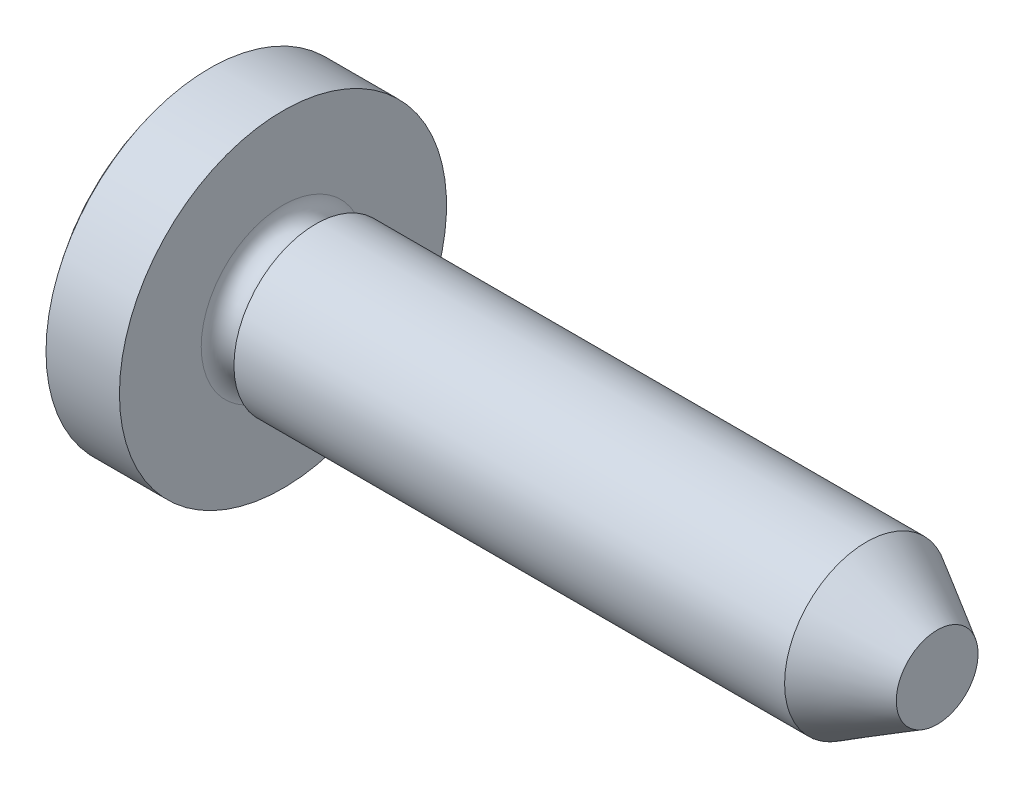
ISO-10303-21;
HEADER;
FILE_DESCRIPTION(('STEP AP214'),'2;1');
FILE_NAME('part.step','',(''),(''),'','','');
FILE_SCHEMA(('AUTOMOTIVE_DESIGN { 1 0 10303 214 1 1 1 1 }'));
ENDSEC;
DATA;
#1=APPLICATION_CONTEXT('core data for automotive mechanical design processes');
#2=APPLICATION_PROTOCOL_DEFINITION('international standard','automotive_design',2000,#1);
#3=PRODUCT_CONTEXT('',#1,'mechanical');
#4=PRODUCT('Part','Part','',(#3));
#5=PRODUCT_RELATED_PRODUCT_CATEGORY('part','',(#4));
#6=PRODUCT_DEFINITION_FORMATION('','',#4);
#7=PRODUCT_DEFINITION_CONTEXT('part definition',#1,'design');
#8=PRODUCT_DEFINITION('design','',#6,#7);
#9=PRODUCT_DEFINITION_SHAPE('','',#8);
#10=(LENGTH_UNIT() NAMED_UNIT(*) SI_UNIT(.MILLI.,.METRE.));
#11=(NAMED_UNIT(*) PLANE_ANGLE_UNIT() SI_UNIT($,.RADIAN.));
#12=(NAMED_UNIT(*) SI_UNIT($,.STERADIAN.) SOLID_ANGLE_UNIT());
#13=UNCERTAINTY_MEASURE_WITH_UNIT(LENGTH_MEASURE(1.E-05),#10,'distance_accuracy_value','');
#14=(GEOMETRIC_REPRESENTATION_CONTEXT(3) GLOBAL_UNCERTAINTY_ASSIGNED_CONTEXT((#13)) GLOBAL_UNIT_ASSIGNED_CONTEXT((#10,
#11,#12)) REPRESENTATION_CONTEXT('',''));
#15=CARTESIAN_POINT('',(0.,0.,0.));
#16=DIRECTION('',(0.,0.,1.));
#17=DIRECTION('',(1.,0.,0.));
#18=AXIS2_PLACEMENT_3D('',#15,#16,#17);
#19=CARTESIAN_POINT('',(0.9,0.189999999999999,-0.190000000000001));
#20=DIRECTION('',(-1.,0.,0.));
#21=DIRECTION('',(0.,0.,1.));
#22=AXIS2_PLACEMENT_3D('',#19,#20,#21);
#23=PLANE('',#22);
#24=DIRECTION('',(0.,1.,0.));
#25=VECTOR('',#24,1.);
#26=CARTESIAN_POINT('',(0.9,0.949999999999999,0.189999999999999));
#27=LINE('',#26,#25);
#28=CARTESIAN_POINT('',(0.9,0.430384757729334,0.189999999999999));
#29=VERTEX_POINT('',#28);
#30=CARTESIAN_POINT('',(0.9,0.189999999999999,0.189999999999999));
#31=VERTEX_POINT('',#30);
#32=EDGE_CURVE('E350',#29,#31,#27,.F.);
#33=ORIENTED_EDGE('',*,*,#32,.F.);
#34=DIRECTION('',(0.,0.,1.));
#35=VECTOR('',#34,1.);
#36=CARTESIAN_POINT('',(0.9,0.430384757729334,0.));
#37=LINE('',#36,#35);
#38=CARTESIAN_POINT('',(0.9,0.430384757729334,-0.190000000000001));
#39=VERTEX_POINT('',#38);
#40=EDGE_CURVE('E345',#39,#29,#37,.T.);
#41=ORIENTED_EDGE('',*,*,#40,.F.);
#42=DIRECTION('',(0.,-1.,0.));
#43=VECTOR('',#42,1.);
#44=CARTESIAN_POINT('',(0.9,0.949999999999999,-0.190000000000001));
#45=LINE('',#44,#43);
#46=CARTESIAN_POINT('',(0.9,0.189999999999999,-0.190000000000001));
#47=VERTEX_POINT('',#46);
#48=EDGE_CURVE('E340',#47,#39,#45,.F.);
#49=ORIENTED_EDGE('',*,*,#48,.F.);
#50=DIRECTION('',(0.,0.,-1.));
#51=VECTOR('',#50,1.);
#52=CARTESIAN_POINT('',(0.9,0.189999999999999,-0.190000000000001));
#53=LINE('',#52,#51);
#54=CARTESIAN_POINT('',(0.9,0.189999999999999,-0.430384757729337));
#55=VERTEX_POINT('',#54);
#56=EDGE_CURVE('E335',#55,#47,#53,.F.);
#57=ORIENTED_EDGE('',*,*,#56,.F.);
#58=DIRECTION('',(0.,1.,0.));
#59=VECTOR('',#58,1.);
#60=CARTESIAN_POINT('',(0.9,0.,-0.430384757729337));
#61=LINE('',#60,#59);
#62=CARTESIAN_POINT('',(0.9,-0.190000000000001,-0.430384757729337));
#63=VERTEX_POINT('',#62);
#64=EDGE_CURVE('E330',#63,#55,#61,.T.);
#65=ORIENTED_EDGE('',*,*,#64,.F.);
#66=DIRECTION('',(0.,0.,1.));
#67=VECTOR('',#66,1.);
#68=CARTESIAN_POINT('',(0.9,-0.190000000000001,-0.190000000000001));
#69=LINE('',#68,#67);
#70=CARTESIAN_POINT('',(0.9,-0.190000000000001,-0.190000000000001));
#71=VERTEX_POINT('',#70);
#72=EDGE_CURVE('E324',#71,#63,#69,.F.);
#73=ORIENTED_EDGE('',*,*,#72,.F.);
#74=DIRECTION('',(0.,1.,0.));
#75=VECTOR('',#74,1.);
#76=CARTESIAN_POINT('',(0.9,-0.95,-0.190000000000001));
#77=LINE('',#76,#75);
#78=CARTESIAN_POINT('',(0.9,-0.430384757729336,-0.190000000000001));
#79=VERTEX_POINT('',#78);
#80=EDGE_CURVE('E379',#79,#71,#77,.T.);
#81=ORIENTED_EDGE('',*,*,#80,.F.);
#82=DIRECTION('',(0.,0.,1.));
#83=VECTOR('',#82,1.);
#84=CARTESIAN_POINT('',(0.9,-0.430384757729336,0.));
#85=LINE('',#84,#83);
#86=CARTESIAN_POINT('',(0.9,-0.430384757729336,0.189999999999999));
#87=VERTEX_POINT('',#86);
#88=EDGE_CURVE('E375',#87,#79,#85,.F.);
#89=ORIENTED_EDGE('',*,*,#88,.F.);
#90=DIRECTION('',(0.,1.,0.));
#91=VECTOR('',#90,1.);
#92=CARTESIAN_POINT('',(0.9,-0.95,0.189999999999999));
#93=LINE('',#92,#91);
#94=CARTESIAN_POINT('',(0.9,-0.190000000000001,0.189999999999999));
#95=VERTEX_POINT('',#94);
#96=EDGE_CURVE('E370',#95,#87,#93,.F.);
#97=ORIENTED_EDGE('',*,*,#96,.F.);
#98=DIRECTION('',(0.,0.,1.));
#99=VECTOR('',#98,1.);
#100=CARTESIAN_POINT('',(0.9,-0.190000000000001,0.189999999999999));
#101=LINE('',#100,#99);
#102=CARTESIAN_POINT('',(0.9,-0.190000000000001,0.430384757729335));
#103=VERTEX_POINT('',#102);
#104=EDGE_CURVE('E365',#103,#95,#101,.F.);
#105=ORIENTED_EDGE('',*,*,#104,.F.);
#106=DIRECTION('',(0.,1.,0.));
#107=VECTOR('',#106,1.);
#108=CARTESIAN_POINT('',(0.9,0.,0.430384757729335));
#109=LINE('',#108,#107);
#110=CARTESIAN_POINT('',(0.9,0.189999999999999,0.430384757729335));
#111=VERTEX_POINT('',#110);
#112=EDGE_CURVE('E360',#111,#103,#109,.F.);
#113=ORIENTED_EDGE('',*,*,#112,.F.);
#114=DIRECTION('',(0.,0.,-1.));
#115=VECTOR('',#114,1.);
#116=CARTESIAN_POINT('',(0.9,0.189999999999999,0.189999999999999));
#117=LINE('',#116,#115);
#118=EDGE_CURVE('E355',#31,#111,#117,.F.);
#119=ORIENTED_EDGE('',*,*,#118,.F.);
#120=EDGE_LOOP('',(#33,#41,#49,#57,#65,#73,#81,#89,#97,#105,#113,#119));
#121=FACE_BOUND('',#120,.T.);
#122=ADVANCED_FACE('F17',(#121),#23,.T.);
#123=CARTESIAN_POINT('',(0.9,-0.95,-0.190000000000001));
#124=DIRECTION('',(0.,0.,1.));
#125=DIRECTION('',(1.,0.,0.));
#126=AXIS2_PLACEMENT_3D('',#123,#124,#125);
#127=PLANE('',#126);
#128=ORIENTED_EDGE('',*,*,#80,.T.);
#129=DIRECTION('',(1.,0.,0.));
#130=VECTOR('',#129,1.);
#131=CARTESIAN_POINT('',(0.9,-0.190000000000001,-0.190000000000001));
#132=LINE('',#131,#130);
#133=CARTESIAN_POINT('',(0.0113012058207812,-0.190000000000001,-0.190000000000001));
#134=VERTEX_POINT('',#133);
#135=EDGE_CURVE('E327',#134,#71,#132,.T.);
#136=ORIENTED_EDGE('',*,*,#135,.F.);
#137=CARTESIAN_POINT('',(0.128116518841079,-0.876031893359466,-0.190000000000001));
#138=CARTESIAN_POINT('',(0.0961555078613219,-0.763820306813493,-0.190000000000008));
#139=CARTESIAN_POINT('',(0.070440392953086,-0.650545189093898,-0.190000000000008));
#140=CARTESIAN_POINT('',(0.0315019552796558,-0.421867891307464,-0.189999999999994));
#141=CARTESIAN_POINT('',(0.0182786325144617,-0.306465711240624,-0.189999999999979));
#142=CARTESIAN_POINT('',(0.0113012058207884,-0.190000000000161,-0.189999999999957));
#143=B_SPLINE_CURVE_WITH_KNOTS('',3,(#137,#138,#139,#140,#141,#142),.UNSPECIFIED.,.F.,.F.,(4,2,
4),(0.,0.348471914022044,0.696943828044088),.UNSPECIFIED.);
#144=CARTESIAN_POINT('',(0.128116518841079,-0.876031893359466,-0.190000000000001));
#145=VERTEX_POINT('',#144);
#146=EDGE_CURVE('E130',#145,#134,#143,.T.);
#147=ORIENTED_EDGE('',*,*,#146,.F.);
#148=DIRECTION('',(-0.866025403784438,-0.500000000000001,0.));
#149=VECTOR('',#148,1.);
#150=CARTESIAN_POINT('',(0.,-0.95,-0.190000000000001));
#151=LINE('',#150,#149);
#152=EDGE_CURVE('E126',#79,#145,#151,.T.);
#153=ORIENTED_EDGE('',*,*,#152,.F.);
#154=EDGE_LOOP('',(#128,#136,#147,#153));
#155=FACE_BOUND('',#154,.T.);
#156=ADVANCED_FACE('F250',(#155),#127,.T.);
#157=CARTESIAN_POINT('',(0.9,-0.190000000000001,-0.190000000000001));
#158=DIRECTION('',(0.,1.,0.));
#159=DIRECTION('',(0.,0.,1.));
#160=AXIS2_PLACEMENT_3D('',#157,#158,#159);
#161=PLANE('',#160);
#162=ORIENTED_EDGE('',*,*,#72,.T.);
#163=DIRECTION('',(0.866025403784438,0.,0.500000000000001));
#164=VECTOR('',#163,1.);
#165=CARTESIAN_POINT('',(0.,-0.190000000000001,-0.950000000000001));
#166=LINE('',#165,#164);
#167=CARTESIAN_POINT('',(0.128116518841082,-0.190000000000001,-0.876031893359465));
#168=VERTEX_POINT('',#167);
#169=EDGE_CURVE('E326',#168,#63,#166,.T.);
#170=ORIENTED_EDGE('',*,*,#169,.F.);
#171=CARTESIAN_POINT('',(3.2,-0.190000000000001,0.));
#172=DIRECTION('',(0.,1.,0.));
#173=DIRECTION('',(0.,0.,1.));
#174=AXIS2_PLACEMENT_3D('',#171,#172,#173);
#175=CIRCLE('',#174,3.19435439486604);
#176=EDGE_CURVE('E241',#134,#168,#175,.F.);
#177=ORIENTED_EDGE('',*,*,#176,.F.);
#178=ORIENTED_EDGE('',*,*,#135,.T.);
#179=EDGE_LOOP('',(#162,#170,#177,#178));
#180=FACE_BOUND('',#179,.T.);
#181=ADVANCED_FACE('F232',(#180),#161,.T.);
#182=CARTESIAN_POINT('',(0.,0.,-0.950000000000001));
#183=DIRECTION('',(-0.500000000000001,0.,0.866025403784438));
#184=DIRECTION('',(0.866025403784438,0.,0.500000000000001));
#185=AXIS2_PLACEMENT_3D('',#182,#183,#184);
#186=PLANE('',#185);
#187=ORIENTED_EDGE('',*,*,#64,.T.);
#188=DIRECTION('',(0.866025403784438,0.,0.500000000000001));
#189=VECTOR('',#188,1.);
#190=CARTESIAN_POINT('',(0.128116518841083,0.189999999999999,-0.876031893359464));
#191=LINE('',#190,#189);
#192=CARTESIAN_POINT('',(0.128116518841084,0.189999999999999,-0.876031893359463));
#193=VERTEX_POINT('',#192);
#194=EDGE_CURVE('E332',#193,#55,#191,.T.);
#195=ORIENTED_EDGE('',*,*,#194,.F.);
#196=CARTESIAN_POINT('',(0.128116518841082,-0.190000000000001,-0.876031893359465));
#197=CARTESIAN_POINT('',(0.124756210927811,-0.126666666666667,-0.877971968037752));
#198=CARTESIAN_POINT('',(0.123076056971175,-0.063333333333334,-0.878942005376895));
#199=CARTESIAN_POINT('',(0.123076056971176,0.0633333333333328,-0.878942005376895));
#200=CARTESIAN_POINT('',(0.124756210927812,0.126666666666666,-0.877971968037751));
#201=CARTESIAN_POINT('',(0.128116518841084,0.189999999999999,-0.876031893359464));
#202=B_SPLINE_CURVE_WITH_KNOTS('',3,(#196,#197,#198,#199,#200,#201),.UNSPECIFIED.,.F.,.F.,(4,2,
4),(0.,0.190089123854617,0.380178247709234),.UNSPECIFIED.);
#203=EDGE_CURVE('E234',#168,#193,#202,.T.);
#204=ORIENTED_EDGE('',*,*,#203,.F.);
#205=ORIENTED_EDGE('',*,*,#169,.T.);
#206=EDGE_LOOP('',(#187,#195,#204,#205));
#207=FACE_BOUND('',#206,.T.);
#208=ADVANCED_FACE('F227',(#207),#186,.T.);
#209=CARTESIAN_POINT('',(0.9,0.189999999999999,-0.190000000000001));
#210=DIRECTION('',(0.,-1.,0.));
#211=DIRECTION('',(0.,0.,-1.));
#212=AXIS2_PLACEMENT_3D('',#209,#210,#211);
#213=PLANE('',#212);
#214=ORIENTED_EDGE('',*,*,#56,.T.);
#215=DIRECTION('',(1.,0.,0.));
#216=VECTOR('',#215,1.);
#217=CARTESIAN_POINT('',(0.9,0.189999999999999,-0.190000000000001));
#218=LINE('',#217,#216);
#219=CARTESIAN_POINT('',(0.0113012058207834,0.189999999999999,-0.190000000000001));
#220=VERTEX_POINT('',#219);
#221=EDGE_CURVE('E337',#220,#47,#218,.T.);
#222=ORIENTED_EDGE('',*,*,#221,.F.);
#223=CARTESIAN_POINT('',(3.2,0.189999999999999,0.));
#224=DIRECTION('',(0.,1.,0.));
#225=DIRECTION('',(0.,0.,1.));
#226=AXIS2_PLACEMENT_3D('',#223,#224,#225);
#227=CIRCLE('',#226,3.19435439486604);
#228=EDGE_CURVE('E217',#193,#220,#227,.T.);
#229=ORIENTED_EDGE('',*,*,#228,.F.);
#230=ORIENTED_EDGE('',*,*,#194,.T.);
#231=EDGE_LOOP('',(#214,#222,#229,#230));
#232=FACE_BOUND('',#231,.T.);
#233=ADVANCED_FACE('F223',(#232),#213,.T.);
#234=CARTESIAN_POINT('',(0.9,0.949999999999999,-0.190000000000001));
#235=DIRECTION('',(0.,0.,1.));
#236=DIRECTION('',(0.,-1.,0.));
#237=AXIS2_PLACEMENT_3D('',#234,#235,#236);
#238=PLANE('',#237);
#239=ORIENTED_EDGE('',*,*,#48,.T.);
#240=DIRECTION('',(0.866025403784438,-0.500000000000001,0.));
#241=VECTOR('',#240,1.);
#242=CARTESIAN_POINT('',(0.,0.949999999999999,-0.190000000000001));
#243=LINE('',#242,#241);
#244=CARTESIAN_POINT('',(0.128116518841085,0.87603189335946,-0.190000000000001));
#245=VERTEX_POINT('',#244);
#246=EDGE_CURVE('E342',#245,#39,#243,.T.);
#247=ORIENTED_EDGE('',*,*,#246,.F.);
#248=CARTESIAN_POINT('',(0.0113012058207832,0.189999999999999,-0.190000000000001));
#249=CARTESIAN_POINT('',(0.0182786325144521,0.306465711240489,-0.190000000000001));
#250=CARTESIAN_POINT('',(0.0315019552796451,0.421867891307355,-0.190000000000001));
#251=CARTESIAN_POINT('',(0.0704403929530793,0.650545189093842,-0.190000000000001));
#252=CARTESIAN_POINT('',(0.0961555078613205,0.763820306813462,-0.190000000000001));
#253=CARTESIAN_POINT('',(0.128116518841086,0.87603189335946,-0.19));
#254=B_SPLINE_CURVE_WITH_KNOTS('',3,(#248,#249,#250,#251,#252,#253),.UNSPECIFIED.,.F.,.F.,(4,2,
4),(0.,0.348471914022122,0.696943828044244),.UNSPECIFIED.);
#255=EDGE_CURVE('E209',#220,#245,#254,.T.);
#256=ORIENTED_EDGE('',*,*,#255,.F.);
#257=ORIENTED_EDGE('',*,*,#221,.T.);
#258=EDGE_LOOP('',(#239,#247,#256,#257));
#259=FACE_BOUND('',#258,.T.);
#260=ADVANCED_FACE('F219',(#259),#238,.T.);
#261=CARTESIAN_POINT('',(0.,0.949999999999999,0.));
#262=DIRECTION('',(-0.500000000000001,-0.866025403784438,0.));
#263=DIRECTION('',(0.866025403784438,-0.500000000000001,0.));
#264=AXIS2_PLACEMENT_3D('',#261,#262,#263);
#265=PLANE('',#264);
#266=ORIENTED_EDGE('',*,*,#40,.T.);
#267=DIRECTION('',(0.866025403784438,-0.500000000000001,0.));
#268=VECTOR('',#267,1.);
#269=CARTESIAN_POINT('',(0.128116518841086,0.87603189335946,0.189999999999999));
#270=LINE('',#269,#268);
#271=CARTESIAN_POINT('',(0.128116518841086,0.87603189335946,0.189999999999999));
#272=VERTEX_POINT('',#271);
#273=EDGE_CURVE('E347',#272,#29,#270,.T.);
#274=ORIENTED_EDGE('',*,*,#273,.F.);
#275=CARTESIAN_POINT('',(0.128116518841086,0.87603189335946,0.189999999999999));
#276=CARTESIAN_POINT('',(0.12307605697118,0.87894200537689,0.0950891447574101));
#277=CARTESIAN_POINT('',(0.12307605697118,0.87894200537689,0.));
#278=B_SPLINE_CURVE_WITH_KNOTS('',2,(#275,#276,#277),.UNSPECIFIED.,.F.,.F.,(3,3),(0.,1.),.UNSPECIFIED.);
#279=CARTESIAN_POINT('',(0.12307605697118,0.87894200537689,0.));
#280=VERTEX_POINT('',#279);
#281=EDGE_CURVE('E208',#280,#272,#278,.F.);
#282=ORIENTED_EDGE('',*,*,#281,.F.);
#283=CARTESIAN_POINT('',(0.12307605697118,0.87894200537689,0.));
#284=CARTESIAN_POINT('',(0.12307605697118,0.87894200537689,-0.0950891447574096));
#285=CARTESIAN_POINT('',(0.128116518841085,0.87603189335946,-0.190000000000001));
#286=B_SPLINE_CURVE_WITH_KNOTS('',2,(#283,#284,#285),.UNSPECIFIED.,.F.,.F.,(3,3),(0.,1.),.UNSPECIFIED.);
#287=EDGE_CURVE('E216',#245,#280,#286,.F.);
#288=ORIENTED_EDGE('',*,*,#287,.F.);
#289=ORIENTED_EDGE('',*,*,#246,.T.);
#290=EDGE_LOOP('',(#266,#274,#282,#288,#289));
#291=FACE_BOUND('',#290,.T.);
#292=ADVANCED_FACE('F197',(#291),#265,.T.);
#293=CARTESIAN_POINT('',(0.9,0.949999999999999,0.189999999999999));
#294=DIRECTION('',(0.,0.,-1.));
#295=DIRECTION('',(0.,1.,0.));
#296=AXIS2_PLACEMENT_3D('',#293,#294,#295);
#297=PLANE('',#296);
#298=ORIENTED_EDGE('',*,*,#32,.T.);
#299=DIRECTION('',(1.,0.,0.));
#300=VECTOR('',#299,1.);
#301=CARTESIAN_POINT('',(0.9,0.189999999999999,0.189999999999999));
#302=LINE('',#301,#300);
#303=CARTESIAN_POINT('',(0.0113012058207827,0.189999999999999,0.189999999999999));
#304=VERTEX_POINT('',#303);
#305=EDGE_CURVE('E352',#304,#31,#302,.T.);
#306=ORIENTED_EDGE('',*,*,#305,.F.);
#307=CARTESIAN_POINT('',(0.128116518841086,0.87603189335946,0.19));
#308=CARTESIAN_POINT('',(0.0961555078613279,0.763820306813488,0.190000000000007));
#309=CARTESIAN_POINT('',(0.0704403929530911,0.650545189093894,0.190000000000007));
#310=CARTESIAN_POINT('',(0.0315019552796592,0.421867891307461,0.189999999999992));
#311=CARTESIAN_POINT('',(0.0182786325144642,0.306465711240622,0.189999999999977));
#312=CARTESIAN_POINT('',(0.0113012058207901,0.19000000000016,0.189999999999956));
#313=B_SPLINE_CURVE_WITH_KNOTS('',3,(#307,#308,#309,#310,#311,#312),.UNSPECIFIED.,.F.,.F.,(4,2,
4),(0.,0.348471914022042,0.696943828044084),.UNSPECIFIED.);
#314=EDGE_CURVE('E201',#272,#304,#313,.T.);
#315=ORIENTED_EDGE('',*,*,#314,.F.);
#316=ORIENTED_EDGE('',*,*,#273,.T.);
#317=EDGE_LOOP('',(#298,#306,#315,#316));
#318=FACE_BOUND('',#317,.T.);
#319=ADVANCED_FACE('F192',(#318),#297,.T.);
#320=CARTESIAN_POINT('',(0.9,0.189999999999999,0.189999999999999));
#321=DIRECTION('',(0.,-1.,0.));
#322=DIRECTION('',(0.,0.,-1.));
#323=AXIS2_PLACEMENT_3D('',#320,#321,#322);
#324=PLANE('',#323);
#325=ORIENTED_EDGE('',*,*,#118,.T.);
#326=DIRECTION('',(-0.866025403784438,0.,0.500000000000001));
#327=VECTOR('',#326,1.);
#328=CARTESIAN_POINT('',(0.,0.189999999999999,0.95));
#329=LINE('',#328,#327);
#330=CARTESIAN_POINT('',(0.128116518841082,0.189999999999999,0.876031893359462));
#331=VERTEX_POINT('',#330);
#332=EDGE_CURVE('E357',#331,#111,#329,.F.);
#333=ORIENTED_EDGE('',*,*,#332,.F.);
#334=CARTESIAN_POINT('',(3.2,0.189999999999999,0.));
#335=DIRECTION('',(0.,1.,0.));
#336=DIRECTION('',(0.,0.,1.));
#337=AXIS2_PLACEMENT_3D('',#334,#335,#336);
#338=CIRCLE('',#337,3.19435439486604);
#339=EDGE_CURVE('E182',#304,#331,#338,.T.);
#340=ORIENTED_EDGE('',*,*,#339,.F.);
#341=ORIENTED_EDGE('',*,*,#305,.T.);
#342=EDGE_LOOP('',(#325,#333,#340,#341));
#343=FACE_BOUND('',#342,.T.);
#344=ADVANCED_FACE('F188',(#343),#324,.T.);
#345=CARTESIAN_POINT('',(0.,0.,0.95));
#346=DIRECTION('',(-0.500000000000001,0.,-0.866025403784438));
#347=DIRECTION('',(-0.866025403784438,0.,0.500000000000001));
#348=AXIS2_PLACEMENT_3D('',#345,#346,#347);
#349=PLANE('',#348);
#350=ORIENTED_EDGE('',*,*,#112,.T.);
#351=DIRECTION('',(0.866025403784438,0.,-0.500000000000001));
#352=VECTOR('',#351,1.);
#353=CARTESIAN_POINT('',(0.128116518841081,-0.190000000000001,0.876031893359463));
#354=LINE('',#353,#352);
#355=CARTESIAN_POINT('',(0.12811651884108,-0.190000000000001,0.876031893359464));
#356=VERTEX_POINT('',#355);
#357=EDGE_CURVE('E362',#356,#103,#354,.T.);
#358=ORIENTED_EDGE('',*,*,#357,.F.);
#359=CARTESIAN_POINT('',(0.128116518841082,0.189999999999999,0.876031893359462));
#360=CARTESIAN_POINT('',(0.124756210927811,0.126666666666666,0.877971968037749));
#361=CARTESIAN_POINT('',(0.123076056971175,0.0633333333333328,0.878942005376893));
#362=CARTESIAN_POINT('',(0.123076056971175,-0.063333333333334,0.878942005376894));
#363=CARTESIAN_POINT('',(0.12475621092781,-0.126666666666667,0.877971968037751));
#364=CARTESIAN_POINT('',(0.128116518841081,-0.190000000000001,0.876031893359464));
#365=B_SPLINE_CURVE_WITH_KNOTS('',3,(#359,#360,#361,#362,#363,#364),.UNSPECIFIED.,.F.,.F.,(4,2,
4),(0.,0.190089123854617,0.380178247709234),.UNSPECIFIED.);
#366=EDGE_CURVE('E175',#331,#356,#365,.T.);
#367=ORIENTED_EDGE('',*,*,#366,.F.);
#368=ORIENTED_EDGE('',*,*,#332,.T.);
#369=EDGE_LOOP('',(#350,#358,#367,#368));
#370=FACE_BOUND('',#369,.T.);
#371=ADVANCED_FACE('F184',(#370),#349,.T.);
#372=CARTESIAN_POINT('',(0.9,-0.190000000000001,0.189999999999999));
#373=DIRECTION('',(0.,1.,0.));
#374=DIRECTION('',(0.,0.,1.));
#375=AXIS2_PLACEMENT_3D('',#372,#373,#374);
#376=PLANE('',#375);
#377=ORIENTED_EDGE('',*,*,#104,.T.);
#378=DIRECTION('',(1.,0.,0.));
#379=VECTOR('',#378,1.);
#380=CARTESIAN_POINT('',(0.9,-0.190000000000001,0.189999999999999));
#381=LINE('',#380,#379);
#382=CARTESIAN_POINT('',(0.0113012058207808,-0.190000000000001,0.189999999999999));
#383=VERTEX_POINT('',#382);
#384=EDGE_CURVE('E367',#383,#95,#381,.T.);
#385=ORIENTED_EDGE('',*,*,#384,.F.);
#386=CARTESIAN_POINT('',(3.2,-0.190000000000001,0.));
#387=DIRECTION('',(0.,1.,0.));
#388=DIRECTION('',(0.,0.,1.));
#389=AXIS2_PLACEMENT_3D('',#386,#387,#388);
#390=CIRCLE('',#389,3.19435439486604);
#391=EDGE_CURVE('E141',#356,#383,#390,.F.);
#392=ORIENTED_EDGE('',*,*,#391,.F.);
#393=ORIENTED_EDGE('',*,*,#357,.T.);
#394=EDGE_LOOP('',(#377,#385,#392,#393));
#395=FACE_BOUND('',#394,.T.);
#396=ADVANCED_FACE('F165',(#395),#376,.T.);
#397=CARTESIAN_POINT('',(0.9,-0.95,0.189999999999999));
#398=DIRECTION('',(0.,0.,-1.));
#399=DIRECTION('',(0.,1.,0.));
#400=AXIS2_PLACEMENT_3D('',#397,#398,#399);
#401=PLANE('',#400);
#402=ORIENTED_EDGE('',*,*,#96,.T.);
#403=DIRECTION('',(-0.866025403784438,-0.500000000000001,0.));
#404=VECTOR('',#403,1.);
#405=CARTESIAN_POINT('',(0.,-0.95,0.189999999999999));
#406=LINE('',#405,#404);
#407=CARTESIAN_POINT('',(0.128116518841078,-0.876031893359466,0.189999999999999));
#408=VERTEX_POINT('',#407);
#409=EDGE_CURVE('E372',#408,#87,#406,.F.);
#410=ORIENTED_EDGE('',*,*,#409,.F.);
#411=CARTESIAN_POINT('',(0.0113012058207814,-0.190000000000001,0.189999999999999));
#412=CARTESIAN_POINT('',(0.018278632514449,-0.306465711240491,0.189999999999999));
#413=CARTESIAN_POINT('',(0.0315019552796408,-0.421867891307358,0.189999999999999));
#414=CARTESIAN_POINT('',(0.0704403929530733,-0.650545189093846,0.189999999999999));
#415=CARTESIAN_POINT('',(0.0961555078613139,-0.763820306813467,0.189999999999999));
#416=CARTESIAN_POINT('',(0.128116518841079,-0.876031893359466,0.189999999999999));
#417=B_SPLINE_CURVE_WITH_KNOTS('',3,(#411,#412,#413,#414,#415,#416),.UNSPECIFIED.,.F.,.F.,(4,2,
4),(0.,0.348471914022124,0.696943828044248),.UNSPECIFIED.);
#418=EDGE_CURVE('E135',#383,#408,#417,.T.);
#419=ORIENTED_EDGE('',*,*,#418,.F.);
#420=ORIENTED_EDGE('',*,*,#384,.T.);
#421=EDGE_LOOP('',(#402,#410,#419,#420));
#422=FACE_BOUND('',#421,.T.);
#423=ADVANCED_FACE('F158',(#422),#401,.T.);
#424=CARTESIAN_POINT('',(0.,-0.95,0.));
#425=DIRECTION('',(-0.500000000000001,0.866025403784438,0.));
#426=DIRECTION('',(-0.866025403784438,-0.500000000000001,0.));
#427=AXIS2_PLACEMENT_3D('',#424,#425,#426);
#428=PLANE('',#427);
#429=ORIENTED_EDGE('',*,*,#88,.T.);
#430=ORIENTED_EDGE('',*,*,#152,.T.);
#431=CARTESIAN_POINT('',(0.128116518841078,-0.876031893359466,-0.190000000000001));
#432=CARTESIAN_POINT('',(0.123076056971172,-0.878942005376896,-0.0950891447574073));
#433=CARTESIAN_POINT('',(0.123076056971172,-0.878942005376896,0.));
#434=B_SPLINE_CURVE_WITH_KNOTS('',2,(#431,#432,#433),.UNSPECIFIED.,.F.,.F.,(3,3),(0.,1.),.UNSPECIFIED.);
#435=CARTESIAN_POINT('',(0.123076056971173,-0.878942005376896,0.));
#436=VERTEX_POINT('',#435);
#437=EDGE_CURVE('E118',#436,#145,#434,.F.);
#438=ORIENTED_EDGE('',*,*,#437,.F.);
#439=CARTESIAN_POINT('',(0.123076056971172,-0.878942005376896,0.));
#440=CARTESIAN_POINT('',(0.123076056971172,-0.878942005376896,0.0950891447574061));
#441=CARTESIAN_POINT('',(0.128116518841078,-0.876031893359466,0.189999999999999));
#442=B_SPLINE_CURVE_WITH_KNOTS('',2,(#439,#440,#441),.UNSPECIFIED.,.F.,.F.,(3,3),(0.,1.),.UNSPECIFIED.);
#443=EDGE_CURVE('E123',#408,#436,#442,.F.);
#444=ORIENTED_EDGE('',*,*,#443,.F.);
#445=ORIENTED_EDGE('',*,*,#409,.T.);
#446=EDGE_LOOP('',(#429,#430,#438,#444,#445));
#447=FACE_BOUND('',#446,.T.);
#448=ADVANCED_FACE('F121',(#447),#428,.T.);
#449=CARTESIAN_POINT('',(3.2,0.,0.));
#450=DIRECTION('',(0.,1.,0.));
#451=DIRECTION('',(1.,0.,0.));
#452=AXIS2_PLACEMENT_3D('',#449,#450,#451);
#453=SPHERICAL_SURFACE('',#452,3.2);
#454=CARTESIAN_POINT('',(0.702000800640645,0.,0.));
#455=DIRECTION('',(-1.,0.,0.));
#456=DIRECTION('',(0.,0.,1.));
#457=AXIS2_PLACEMENT_3D('',#454,#455,#456);
#458=CIRCLE('',#457,1.99999999999998);
#459=CARTESIAN_POINT('',(0.702000800640645,0.,1.99999999999998));
#460=VERTEX_POINT('',#459);
#461=EDGE_CURVE('E136',#460,#460,#458,.F.);
#462=ORIENTED_EDGE('',*,*,#461,.F.);
#463=EDGE_LOOP('',(#462));
#464=FACE_BOUND('',#463,.T.);
#465=ORIENTED_EDGE('',*,*,#418,.T.);
#466=ORIENTED_EDGE('',*,*,#443,.T.);
#467=ORIENTED_EDGE('',*,*,#437,.T.);
#468=ORIENTED_EDGE('',*,*,#146,.T.);
#469=ORIENTED_EDGE('',*,*,#176,.T.);
#470=ORIENTED_EDGE('',*,*,#203,.T.);
#471=ORIENTED_EDGE('',*,*,#228,.T.);
#472=ORIENTED_EDGE('',*,*,#255,.T.);
#473=ORIENTED_EDGE('',*,*,#287,.T.);
#474=ORIENTED_EDGE('',*,*,#281,.T.);
#475=ORIENTED_EDGE('',*,*,#314,.T.);
#476=ORIENTED_EDGE('',*,*,#339,.T.);
#477=ORIENTED_EDGE('',*,*,#366,.T.);
#478=ORIENTED_EDGE('',*,*,#391,.T.);
#479=EDGE_LOOP('',(#465,#466,#467,#468,#469,#470,#471,#472,#473,#474,#475,#476,#477,#478));
#480=FACE_BOUND('',#479,.T.);
#481=ADVANCED_FACE('F132',(#464,#480),#453,.T.);
#482=CARTESIAN_POINT('',(-96.3851955307263,0.,0.));
#483=DIRECTION('',(-1.,0.,0.));
#484=DIRECTION('',(0.,0.,1.));
#485=AXIS2_PLACEMENT_3D('',#482,#483,#484);
#486=CYLINDRICAL_SURFACE('',#485,1.99999999999998);
#487=ORIENTED_EDGE('',*,*,#461,.T.);
#488=EDGE_LOOP('',(#487));
#489=FACE_BOUND('',#488,.T.);
#490=CARTESIAN_POINT('',(1.6,0.,0.));
#491=DIRECTION('',(-1.,0.,0.));
#492=DIRECTION('',(0.,0.,1.));
#493=AXIS2_PLACEMENT_3D('',#490,#491,#492);
#494=CIRCLE('',#493,1.99999999999998);
#495=CARTESIAN_POINT('',(1.6,0.,1.99999999999998));
#496=VERTEX_POINT('',#495);
#497=EDGE_CURVE('E139',#496,#496,#494,.T.);
#498=ORIENTED_EDGE('',*,*,#497,.T.);
#499=EDGE_LOOP('',(#498));
#500=FACE_BOUND('',#499,.T.);
#501=ADVANCED_FACE('F297',(#489,#500),#486,.T.);
#502=CARTESIAN_POINT('',(1.6,0.999999999999981,0.));
#503=DIRECTION('',(-1.,0.,0.));
#504=DIRECTION('',(0.,0.,1.));
#505=AXIS2_PLACEMENT_3D('',#502,#503,#504);
#506=PLANE('',#505);
#507=CARTESIAN_POINT('',(1.6,0.,0.));
#508=DIRECTION('',(1.,0.,0.));
#509=DIRECTION('',(0.,0.,1.));
#510=AXIS2_PLACEMENT_3D('',#507,#508,#509);
#511=CIRCLE('',#510,0.999999999999981);
#512=CARTESIAN_POINT('',(1.6,0.,-0.999999999999981));
#513=VERTEX_POINT('',#512);
#514=CARTESIAN_POINT('',(1.6,0.,0.999999999999981));
#515=VERTEX_POINT('',#514);
#516=EDGE_CURVE('E285',#513,#515,#511,.F.);
#517=ORIENTED_EDGE('',*,*,#516,.T.);
#518=CARTESIAN_POINT('',(1.6,0.,0.));
#519=DIRECTION('',(1.,0.,0.));
#520=DIRECTION('',(0.,0.,-1.));
#521=AXIS2_PLACEMENT_3D('',#518,#519,#520);
#522=CIRCLE('',#521,0.999999999999981);
#523=EDGE_CURVE('E36',#515,#513,#522,.F.);
#524=ORIENTED_EDGE('',*,*,#523,.T.);
#525=EDGE_LOOP('',(#517,#524));
#526=FACE_BOUND('',#525,.T.);
#527=ORIENTED_EDGE('',*,*,#497,.F.);
#528=EDGE_LOOP('',(#527));
#529=FACE_BOUND('',#528,.T.);
#530=ADVANCED_FACE('F289',(#526,#529),#506,.F.);
#531=CARTESIAN_POINT('',(9.6,0.,0.));
#532=DIRECTION('',(-1.,0.,0.));
#533=DIRECTION('',(0.,0.,1.));
#534=AXIS2_PLACEMENT_3D('',#531,#532,#533);
#535=PLANE('',#534);
#536=CARTESIAN_POINT('',(9.60000000003447,0.,0.));
#537=DIRECTION('',(-1.,0.,0.));
#538=DIRECTION('',(0.,0.,1.));
#539=AXIS2_PLACEMENT_3D('',#536,#537,#538);
#540=CIRCLE('',#539,0.499999999988178);
#541=CARTESIAN_POINT('',(9.60000000003447,0.,0.499999999988178));
#542=VERTEX_POINT('',#541);
#543=EDGE_CURVE('E319',#542,#542,#540,.T.);
#544=ORIENTED_EDGE('',*,*,#543,.F.);
#545=EDGE_LOOP('',(#544));
#546=FACE_BOUND('',#545,.T.);
#547=ADVANCED_FACE('F277',(#546),#535,.F.);
#548=CARTESIAN_POINT('',(1.8,0.,0.));
#549=DIRECTION('',(1.,0.,0.));
#550=DIRECTION('',(0.,0.,-1.));
#551=AXIS2_PLACEMENT_3D('',#548,#549,#550);
#552=TOROIDAL_SURFACE('',#551,0.999999999999981,0.2);
#553=ORIENTED_EDGE('',*,*,#523,.F.);
#554=ORIENTED_EDGE('',*,*,#516,.F.);
#555=EDGE_LOOP('',(#553,#554));
#556=FACE_BOUND('',#555,.T.);
#557=CARTESIAN_POINT('',(2.,0.,0.));
#558=DIRECTION('',(-1.,0.,0.));
#559=DIRECTION('',(0.,0.,1.));
#560=AXIS2_PLACEMENT_3D('',#557,#558,#559);
#561=CIRCLE('',#560,0.999999999999984);
#562=CARTESIAN_POINT('',(2.,0.,0.999999999999984));
#563=VERTEX_POINT('',#562);
#564=EDGE_CURVE('E11',#563,#563,#561,.F.);
#565=ORIENTED_EDGE('',*,*,#564,.F.);
#566=EDGE_LOOP('',(#565));
#567=FACE_BOUND('',#566,.T.);
#568=ADVANCED_FACE('F269',(#556,#567),#552,.F.);
#569=CARTESIAN_POINT('',(8.73397459622538,0.,0.));
#570=DIRECTION('',(-1.,0.,0.));
#571=DIRECTION('',(0.,0.,1.));
#572=AXIS2_PLACEMENT_3D('',#569,#570,#571);
#573=CONICAL_SURFACE('',#572,0.999999999976354,0.523598775575734);
#574=CARTESIAN_POINT('',(8.73397459621556,0.,0.));
#575=DIRECTION('',(-1.,0.,0.));
#576=DIRECTION('',(0.,0.,1.));
#577=AXIS2_PLACEMENT_3D('',#574,#575,#576);
#578=CIRCLE('',#577,0.999999999999984);
#579=CARTESIAN_POINT('',(8.73397459621556,0.,0.999999999999984));
#580=VERTEX_POINT('',#579);
#581=EDGE_CURVE('E28',#580,#580,#578,.T.);
#582=ORIENTED_EDGE('',*,*,#581,.F.);
#583=EDGE_LOOP('',(#582));
#584=FACE_BOUND('',#583,.T.);
#585=ORIENTED_EDGE('',*,*,#543,.T.);
#586=EDGE_LOOP('',(#585));
#587=FACE_BOUND('',#586,.T.);
#588=ADVANCED_FACE('F263',(#584,#587),#573,.T.);
#589=CARTESIAN_POINT('',(-96.3851955307263,0.,0.));
#590=DIRECTION('',(-1.,0.,0.));
#591=DIRECTION('',(0.,0.,1.));
#592=AXIS2_PLACEMENT_3D('',#589,#590,#591);
#593=CYLINDRICAL_SURFACE('',#592,0.999999999999984);
#594=ORIENTED_EDGE('',*,*,#564,.T.);
#595=EDGE_LOOP('',(#594));
#596=FACE_BOUND('',#595,.T.);
#597=ORIENTED_EDGE('',*,*,#581,.T.);
#598=EDGE_LOOP('',(#597));
#599=FACE_BOUND('',#598,.T.);
#600=ADVANCED_FACE('F261',(#596,#599),#593,.T.);
#601=CLOSED_SHELL('',(#122,#156,#181,#208,#233,#260,#292,#319,#344,#371,#396,#423,#448,#481,
#501,#530,#547,#568,#588,#600));
#602=MANIFOLD_SOLID_BREP('B1',#601);
#603=ADVANCED_BREP_SHAPE_REPRESENTATION('',(#18,#602),#14);
#604=SHAPE_DEFINITION_REPRESENTATION(#9,#603);
ENDSEC;
END-ISO-10303-21;
